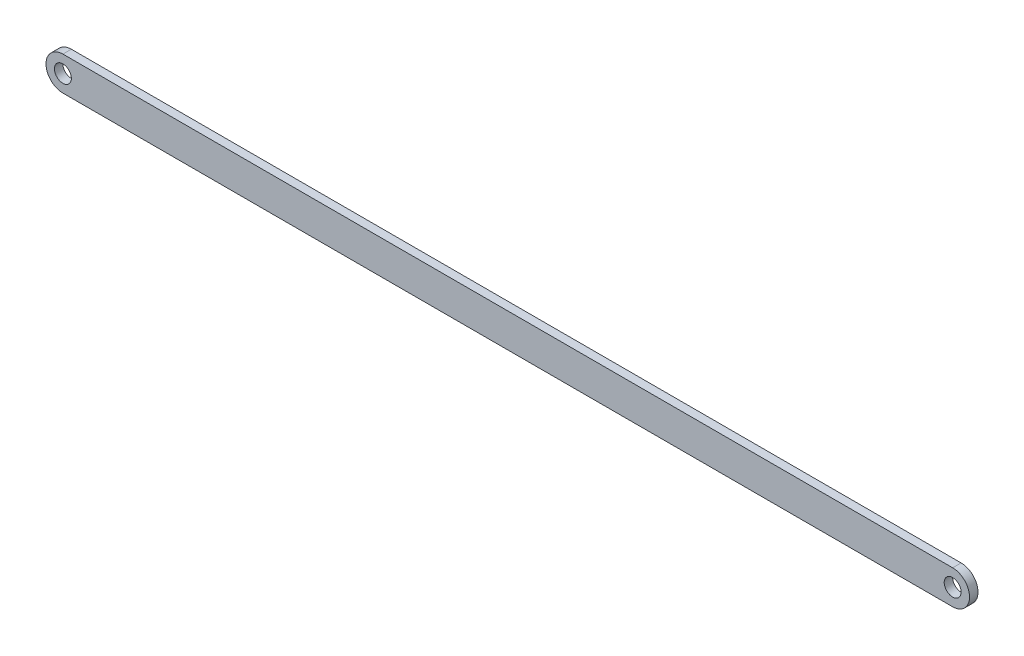
ISO-10303-21;
HEADER;
FILE_DESCRIPTION(('STEP AP214'),'2;1');
FILE_NAME('part.step','',(''),(''),'','','');
FILE_SCHEMA(('AUTOMOTIVE_DESIGN { 1 0 10303 214 1 1 1 1 }'));
ENDSEC;
DATA;
#1=APPLICATION_CONTEXT('core data for automotive mechanical design processes');
#2=APPLICATION_PROTOCOL_DEFINITION('international standard','automotive_design',2000,#1);
#3=PRODUCT_CONTEXT('',#1,'mechanical');
#4=PRODUCT('Part','Part','',(#3));
#5=PRODUCT_RELATED_PRODUCT_CATEGORY('part','',(#4));
#6=PRODUCT_DEFINITION_FORMATION('','',#4);
#7=PRODUCT_DEFINITION_CONTEXT('part definition',#1,'design');
#8=PRODUCT_DEFINITION('design','',#6,#7);
#9=PRODUCT_DEFINITION_SHAPE('','',#8);
#10=(LENGTH_UNIT() NAMED_UNIT(*) SI_UNIT(.MILLI.,.METRE.));
#11=(NAMED_UNIT(*) PLANE_ANGLE_UNIT() SI_UNIT($,.RADIAN.));
#12=(NAMED_UNIT(*) SI_UNIT($,.STERADIAN.) SOLID_ANGLE_UNIT());
#13=UNCERTAINTY_MEASURE_WITH_UNIT(LENGTH_MEASURE(1.E-05),#10,'distance_accuracy_value','');
#14=(GEOMETRIC_REPRESENTATION_CONTEXT(3) GLOBAL_UNCERTAINTY_ASSIGNED_CONTEXT((#13)) GLOBAL_UNIT_ASSIGNED_CONTEXT((#10,
#11,#12)) REPRESENTATION_CONTEXT('',''));
#15=CARTESIAN_POINT('',(0.,0.,0.));
#16=DIRECTION('',(0.,0.,1.));
#17=DIRECTION('',(1.,0.,0.));
#18=AXIS2_PLACEMENT_3D('',#15,#16,#17);
#19=CARTESIAN_POINT('',(52.66,0.,1.));
#20=DIRECTION('',(0.,0.,-1.));
#21=DIRECTION('',(-1.,0.,0.));
#22=AXIS2_PLACEMENT_3D('',#19,#20,#21);
#23=PLANE('',#22);
#24=CARTESIAN_POINT('',(52.66,0.,1.));
#25=DIRECTION('',(0.,0.,1.));
#26=DIRECTION('',(-1.,0.,0.));
#27=AXIS2_PLACEMENT_3D('',#24,#25,#26);
#28=CIRCLE('',#27,2.);
#29=CARTESIAN_POINT('',(52.66,-2.,1.));
#30=VERTEX_POINT('',#29);
#31=CARTESIAN_POINT('',(52.66,2.,1.));
#32=VERTEX_POINT('',#31);
#33=EDGE_CURVE('E96',#30,#32,#28,.T.);
#34=ORIENTED_EDGE('',*,*,#33,.T.);
#35=DIRECTION('',(-1.,0.,0.));
#36=VECTOR('',#35,1.);
#37=CARTESIAN_POINT('',(-52.66,2.,1.));
#38=LINE('',#37,#36);
#39=CARTESIAN_POINT('',(-52.66,2.,1.));
#40=VERTEX_POINT('',#39);
#41=EDGE_CURVE('E91',#32,#40,#38,.T.);
#42=ORIENTED_EDGE('',*,*,#41,.T.);
#43=CARTESIAN_POINT('',(-52.66,0.,1.));
#44=DIRECTION('',(0.,0.,1.));
#45=DIRECTION('',(1.,0.,0.));
#46=AXIS2_PLACEMENT_3D('',#43,#44,#45);
#47=CIRCLE('',#46,2.);
#48=CARTESIAN_POINT('',(-52.66,-2.,1.));
#49=VERTEX_POINT('',#48);
#50=EDGE_CURVE('E94',#40,#49,#47,.T.);
#51=ORIENTED_EDGE('',*,*,#50,.T.);
#52=DIRECTION('',(1.,0.,0.));
#53=VECTOR('',#52,1.);
#54=CARTESIAN_POINT('',(-52.66,-2.,1.));
#55=LINE('',#54,#53);
#56=EDGE_CURVE('E61',#49,#30,#55,.T.);
#57=ORIENTED_EDGE('',*,*,#56,.T.);
#58=EDGE_LOOP('',(#34,#42,#51,#57));
#59=FACE_BOUND('',#58,.T.);
#60=CARTESIAN_POINT('',(-52.66,0.,1.));
#61=DIRECTION('',(0.,0.,1.));
#62=DIRECTION('',(1.,0.,0.));
#63=AXIS2_PLACEMENT_3D('',#60,#61,#62);
#64=CIRCLE('',#63,0.999999999999998);
#65=CARTESIAN_POINT('',(-51.66,0.,1.));
#66=VERTEX_POINT('',#65);
#67=EDGE_CURVE('E116',#66,#66,#64,.T.);
#68=ORIENTED_EDGE('',*,*,#67,.F.);
#69=EDGE_LOOP('',(#68));
#70=FACE_BOUND('',#69,.T.);
#71=CARTESIAN_POINT('',(52.66,0.,1.));
#72=DIRECTION('',(0.,0.,1.));
#73=DIRECTION('',(1.,0.,0.));
#74=AXIS2_PLACEMENT_3D('',#71,#72,#73);
#75=CIRCLE('',#74,0.999999999999998);
#76=CARTESIAN_POINT('',(53.66,0.,1.));
#77=VERTEX_POINT('',#76);
#78=EDGE_CURVE('E138',#77,#77,#75,.T.);
#79=ORIENTED_EDGE('',*,*,#78,.F.);
#80=EDGE_LOOP('',(#79));
#81=FACE_BOUND('',#80,.T.);
#82=ADVANCED_FACE('F43',(#59,#70,#81),#23,.F.);
#83=CARTESIAN_POINT('',(52.66,0.,0.));
#84=DIRECTION('',(0.,0.,-1.));
#85=DIRECTION('',(-1.,0.,0.));
#86=AXIS2_PLACEMENT_3D('',#83,#84,#85);
#87=PLANE('',#86);
#88=CARTESIAN_POINT('',(-52.66,0.,0.));
#89=DIRECTION('',(0.,0.,1.));
#90=DIRECTION('',(1.,0.,0.));
#91=AXIS2_PLACEMENT_3D('',#88,#89,#90);
#92=CIRCLE('',#91,0.999999999999998);
#93=CARTESIAN_POINT('',(-51.66,0.,0.));
#94=VERTEX_POINT('',#93);
#95=EDGE_CURVE('E134',#94,#94,#92,.T.);
#96=ORIENTED_EDGE('',*,*,#95,.T.);
#97=EDGE_LOOP('',(#96));
#98=FACE_BOUND('',#97,.T.);
#99=CARTESIAN_POINT('',(52.66,0.,0.));
#100=DIRECTION('',(0.,0.,1.));
#101=DIRECTION('',(-1.,0.,0.));
#102=AXIS2_PLACEMENT_3D('',#99,#100,#101);
#103=CIRCLE('',#102,2.);
#104=CARTESIAN_POINT('',(52.66,-2.,0.));
#105=VERTEX_POINT('',#104);
#106=CARTESIAN_POINT('',(52.66,2.,0.));
#107=VERTEX_POINT('',#106);
#108=EDGE_CURVE('E112',#105,#107,#103,.T.);
#109=ORIENTED_EDGE('',*,*,#108,.F.);
#110=DIRECTION('',(1.,0.,0.));
#111=VECTOR('',#110,1.);
#112=CARTESIAN_POINT('',(-52.66,-2.,0.));
#113=LINE('',#112,#111);
#114=CARTESIAN_POINT('',(-52.66,-2.,0.));
#115=VERTEX_POINT('',#114);
#116=EDGE_CURVE('E84',#115,#105,#113,.T.);
#117=ORIENTED_EDGE('',*,*,#116,.F.);
#118=CARTESIAN_POINT('',(-52.66,0.,0.));
#119=DIRECTION('',(0.,0.,1.));
#120=DIRECTION('',(1.,0.,0.));
#121=AXIS2_PLACEMENT_3D('',#118,#119,#120);
#122=CIRCLE('',#121,2.);
#123=CARTESIAN_POINT('',(-52.66,2.,0.));
#124=VERTEX_POINT('',#123);
#125=EDGE_CURVE('E78',#124,#115,#122,.T.);
#126=ORIENTED_EDGE('',*,*,#125,.F.);
#127=DIRECTION('',(-1.,0.,0.));
#128=VECTOR('',#127,1.);
#129=CARTESIAN_POINT('',(-52.66,2.,0.));
#130=LINE('',#129,#128);
#131=EDGE_CURVE('E101',#107,#124,#130,.T.);
#132=ORIENTED_EDGE('',*,*,#131,.F.);
#133=EDGE_LOOP('',(#109,#117,#126,#132));
#134=FACE_BOUND('',#133,.T.);
#135=CARTESIAN_POINT('',(52.66,0.,0.));
#136=DIRECTION('',(0.,0.,1.));
#137=DIRECTION('',(1.,0.,0.));
#138=AXIS2_PLACEMENT_3D('',#135,#136,#137);
#139=CIRCLE('',#138,0.999999999999998);
#140=CARTESIAN_POINT('',(53.66,0.,0.));
#141=VERTEX_POINT('',#140);
#142=EDGE_CURVE('E142',#141,#141,#139,.T.);
#143=ORIENTED_EDGE('',*,*,#142,.T.);
#144=EDGE_LOOP('',(#143));
#145=FACE_BOUND('',#144,.T.);
#146=ADVANCED_FACE('F129',(#98,#134,#145),#87,.T.);
#147=CARTESIAN_POINT('',(52.66,0.,1.));
#148=DIRECTION('',(0.,0.,-1.));
#149=DIRECTION('',(-1.,0.,0.));
#150=AXIS2_PLACEMENT_3D('',#147,#148,#149);
#151=CYLINDRICAL_SURFACE('',#150,2.);
#152=ORIENTED_EDGE('',*,*,#108,.T.);
#153=DIRECTION('',(0.,0.,-1.));
#154=VECTOR('',#153,1.);
#155=CARTESIAN_POINT('',(52.66,2.,1.));
#156=LINE('',#155,#154);
#157=EDGE_CURVE('E11',#32,#107,#156,.T.);
#158=ORIENTED_EDGE('',*,*,#157,.F.);
#159=ORIENTED_EDGE('',*,*,#33,.F.);
#160=DIRECTION('',(0.,0.,-1.));
#161=VECTOR('',#160,1.);
#162=CARTESIAN_POINT('',(52.66,-2.,1.));
#163=LINE('',#162,#161);
#164=EDGE_CURVE('E108',#30,#105,#163,.T.);
#165=ORIENTED_EDGE('',*,*,#164,.T.);
#166=EDGE_LOOP('',(#152,#158,#159,#165));
#167=FACE_BOUND('',#166,.T.);
#168=ADVANCED_FACE('F45',(#167),#151,.T.);
#169=CARTESIAN_POINT('',(-52.66,2.,1.));
#170=DIRECTION('',(0.,-1.,0.));
#171=DIRECTION('',(0.,0.,-1.));
#172=AXIS2_PLACEMENT_3D('',#169,#170,#171);
#173=PLANE('',#172);
#174=ORIENTED_EDGE('',*,*,#131,.T.);
#175=DIRECTION('',(0.,0.,-1.));
#176=VECTOR('',#175,1.);
#177=CARTESIAN_POINT('',(-52.66,2.,1.));
#178=LINE('',#177,#176);
#179=EDGE_CURVE('E53',#40,#124,#178,.T.);
#180=ORIENTED_EDGE('',*,*,#179,.F.);
#181=ORIENTED_EDGE('',*,*,#41,.F.);
#182=ORIENTED_EDGE('',*,*,#157,.T.);
#183=EDGE_LOOP('',(#174,#180,#181,#182));
#184=FACE_BOUND('',#183,.T.);
#185=ADVANCED_FACE('F100',(#184),#173,.F.);
#186=CARTESIAN_POINT('',(-52.66,0.,1.));
#187=DIRECTION('',(0.,0.,-1.));
#188=DIRECTION('',(-1.,0.,0.));
#189=AXIS2_PLACEMENT_3D('',#186,#187,#188);
#190=CYLINDRICAL_SURFACE('',#189,2.);
#191=ORIENTED_EDGE('',*,*,#125,.T.);
#192=DIRECTION('',(0.,0.,-1.));
#193=VECTOR('',#192,1.);
#194=CARTESIAN_POINT('',(-52.66,-2.,1.));
#195=LINE('',#194,#193);
#196=EDGE_CURVE('E103',#49,#115,#195,.T.);
#197=ORIENTED_EDGE('',*,*,#196,.F.);
#198=ORIENTED_EDGE('',*,*,#50,.F.);
#199=ORIENTED_EDGE('',*,*,#179,.T.);
#200=EDGE_LOOP('',(#191,#197,#198,#199));
#201=FACE_BOUND('',#200,.T.);
#202=ADVANCED_FACE('F104',(#201),#190,.T.);
#203=CARTESIAN_POINT('',(-52.66,-2.,1.));
#204=DIRECTION('',(0.,1.,0.));
#205=DIRECTION('',(0.,0.,1.));
#206=AXIS2_PLACEMENT_3D('',#203,#204,#205);
#207=PLANE('',#206);
#208=ORIENTED_EDGE('',*,*,#116,.T.);
#209=ORIENTED_EDGE('',*,*,#164,.F.);
#210=ORIENTED_EDGE('',*,*,#56,.F.);
#211=ORIENTED_EDGE('',*,*,#196,.T.);
#212=EDGE_LOOP('',(#208,#209,#210,#211));
#213=FACE_BOUND('',#212,.T.);
#214=ADVANCED_FACE('F126',(#213),#207,.F.);
#215=CARTESIAN_POINT('',(-52.66,0.,1.));
#216=DIRECTION('',(0.,0.,-1.));
#217=DIRECTION('',(-1.,0.,0.));
#218=AXIS2_PLACEMENT_3D('',#215,#216,#217);
#219=CYLINDRICAL_SURFACE('',#218,0.999999999999998);
#220=ORIENTED_EDGE('',*,*,#67,.T.);
#221=EDGE_LOOP('',(#220));
#222=FACE_BOUND('',#221,.T.);
#223=ORIENTED_EDGE('',*,*,#95,.F.);
#224=EDGE_LOOP('',(#223));
#225=FACE_BOUND('',#224,.T.);
#226=ADVANCED_FACE('F161',(#222,#225),#219,.F.);
#227=CARTESIAN_POINT('',(52.66,0.,1.));
#228=DIRECTION('',(0.,0.,-1.));
#229=DIRECTION('',(-1.,0.,0.));
#230=AXIS2_PLACEMENT_3D('',#227,#228,#229);
#231=CYLINDRICAL_SURFACE('',#230,0.999999999999998);
#232=ORIENTED_EDGE('',*,*,#78,.T.);
#233=EDGE_LOOP('',(#232));
#234=FACE_BOUND('',#233,.T.);
#235=ORIENTED_EDGE('',*,*,#142,.F.);
#236=EDGE_LOOP('',(#235));
#237=FACE_BOUND('',#236,.T.);
#238=ADVANCED_FACE('F150',(#234,#237),#231,.F.);
#239=CLOSED_SHELL('',(#82,#146,#168,#185,#202,#214,#226,#238));
#240=MANIFOLD_SOLID_BREP('B2',#239);
#241=ADVANCED_BREP_SHAPE_REPRESENTATION('',(#18,#240),#14);
#242=SHAPE_DEFINITION_REPRESENTATION(#9,#241);
ENDSEC;
END-ISO-10303-21;
